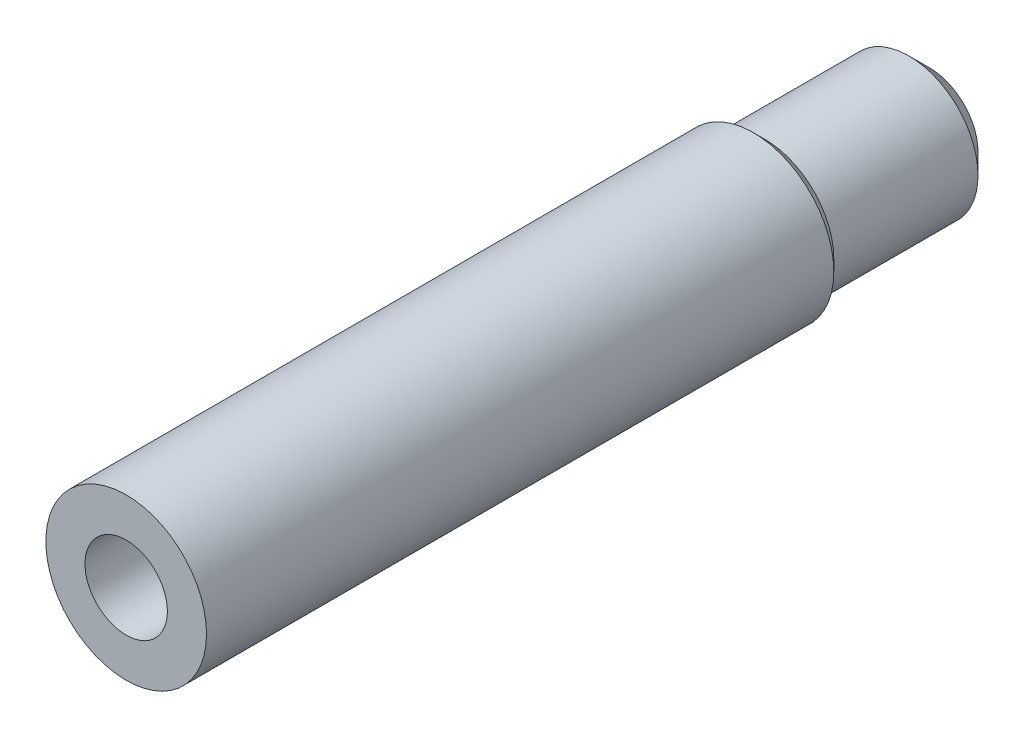
ISO-10303-21;
HEADER;
FILE_DESCRIPTION(('STEP AP214'),'2;1');
FILE_NAME('part.step','',(''),(''),'','','');
FILE_SCHEMA(('AUTOMOTIVE_DESIGN { 1 0 10303 214 1 1 1 1 }'));
ENDSEC;
DATA;
#1=APPLICATION_CONTEXT('core data for automotive mechanical design processes');
#2=APPLICATION_PROTOCOL_DEFINITION('international standard','automotive_design',2000,#1);
#3=PRODUCT_CONTEXT('',#1,'mechanical');
#4=PRODUCT('Part','Part','',(#3));
#5=PRODUCT_RELATED_PRODUCT_CATEGORY('part','',(#4));
#6=PRODUCT_DEFINITION_FORMATION('','',#4);
#7=PRODUCT_DEFINITION_CONTEXT('part definition',#1,'design');
#8=PRODUCT_DEFINITION('design','',#6,#7);
#9=PRODUCT_DEFINITION_SHAPE('','',#8);
#10=(LENGTH_UNIT() NAMED_UNIT(*) SI_UNIT(.MILLI.,.METRE.));
#11=(NAMED_UNIT(*) PLANE_ANGLE_UNIT() SI_UNIT($,.RADIAN.));
#12=(NAMED_UNIT(*) SI_UNIT($,.STERADIAN.) SOLID_ANGLE_UNIT());
#13=UNCERTAINTY_MEASURE_WITH_UNIT(LENGTH_MEASURE(1.E-05),#10,'distance_accuracy_value','');
#14=(GEOMETRIC_REPRESENTATION_CONTEXT(3) GLOBAL_UNCERTAINTY_ASSIGNED_CONTEXT((#13)) GLOBAL_UNIT_ASSIGNED_CONTEXT((#10,
#11,#12)) REPRESENTATION_CONTEXT('',''));
#15=CARTESIAN_POINT('',(0.,0.,0.));
#16=DIRECTION('',(0.,0.,1.));
#17=DIRECTION('',(1.,0.,0.));
#18=AXIS2_PLACEMENT_3D('',#15,#16,#17);
#19=CARTESIAN_POINT('',(0.,0.,9.));
#20=DIRECTION('',(0.,0.,-1.));
#21=DIRECTION('',(-1.,0.,0.));
#22=AXIS2_PLACEMENT_3D('',#19,#20,#21);
#23=CYLINDRICAL_SURFACE('',#22,3.35);
#24=CARTESIAN_POINT('',(0.,0.,0.999999999999997));
#25=DIRECTION('',(0.,0.,1.));
#26=DIRECTION('',(1.,0.,0.));
#27=AXIS2_PLACEMENT_3D('',#24,#25,#26);
#28=CIRCLE('',#27,3.35);
#29=CARTESIAN_POINT('',(3.35,0.,0.999999999999997));
#30=VERTEX_POINT('',#29);
#31=EDGE_CURVE('E52',#30,#30,#28,.T.);
#32=ORIENTED_EDGE('',*,*,#31,.T.);
#33=EDGE_LOOP('',(#32));
#34=FACE_BOUND('',#33,.T.);
#35=CARTESIAN_POINT('',(0.,0.,7.99999999999999));
#36=DIRECTION('',(0.,0.,1.));
#37=DIRECTION('',(1.,0.,0.));
#38=AXIS2_PLACEMENT_3D('',#35,#36,#37);
#39=CIRCLE('',#38,3.35);
#40=CARTESIAN_POINT('',(3.35,0.,7.99999999999999));
#41=VERTEX_POINT('',#40);
#42=EDGE_CURVE('E77',#41,#41,#39,.F.);
#43=ORIENTED_EDGE('',*,*,#42,.T.);
#44=EDGE_LOOP('',(#43));
#45=FACE_BOUND('',#44,.T.);
#46=ADVANCED_FACE('F45',(#34,#45),#23,.T.);
#47=CARTESIAN_POINT('',(0.,0.,0.));
#48=DIRECTION('',(0.,0.,1.));
#49=DIRECTION('',(1.,0.,0.));
#50=AXIS2_PLACEMENT_3D('',#47,#48,#49);
#51=PLANE('',#50);
#52=CARTESIAN_POINT('',(0.,0.,0.));
#53=DIRECTION('',(0.,0.,1.));
#54=DIRECTION('',(1.,0.,0.));
#55=AXIS2_PLACEMENT_3D('',#52,#53,#54);
#56=CIRCLE('',#55,2.);
#57=CARTESIAN_POINT('',(2.,0.,0.));
#58=VERTEX_POINT('',#57);
#59=EDGE_CURVE('E68',#58,#58,#56,.T.);
#60=ORIENTED_EDGE('',*,*,#59,.T.);
#61=EDGE_LOOP('',(#60));
#62=FACE_BOUND('',#61,.T.);
#63=CARTESIAN_POINT('',(0.,0.,0.));
#64=DIRECTION('',(0.,0.,1.));
#65=DIRECTION('',(1.,0.,0.));
#66=AXIS2_PLACEMENT_3D('',#63,#64,#65);
#67=CIRCLE('',#66,2.35);
#68=CARTESIAN_POINT('',(2.35,0.,0.));
#69=VERTEX_POINT('',#68);
#70=EDGE_CURVE('E10',#69,#69,#67,.F.);
#71=ORIENTED_EDGE('',*,*,#70,.T.);
#72=EDGE_LOOP('',(#71));
#73=FACE_BOUND('',#72,.T.);
#74=ADVANCED_FACE('F100',(#62,#73),#51,.F.);
#75=CARTESIAN_POINT('',(0.,0.,39.));
#76=DIRECTION('',(0.,0.,-1.));
#77=DIRECTION('',(-1.,0.,0.));
#78=AXIS2_PLACEMENT_3D('',#75,#76,#77);
#79=CYLINDRICAL_SURFACE('',#78,3.9);
#80=CARTESIAN_POINT('',(0.,0.,8.54999999999999));
#81=DIRECTION('',(0.,0.,1.));
#82=DIRECTION('',(1.,0.,0.));
#83=AXIS2_PLACEMENT_3D('',#80,#81,#82);
#84=CIRCLE('',#83,3.9);
#85=CARTESIAN_POINT('',(3.9,0.,8.54999999999999));
#86=VERTEX_POINT('',#85);
#87=EDGE_CURVE('E59',#86,#86,#84,.T.);
#88=ORIENTED_EDGE('',*,*,#87,.T.);
#89=EDGE_LOOP('',(#88));
#90=FACE_BOUND('',#89,.T.);
#91=CARTESIAN_POINT('',(0.,0.,39.));
#92=DIRECTION('',(0.,0.,1.));
#93=DIRECTION('',(1.,0.,0.));
#94=AXIS2_PLACEMENT_3D('',#91,#92,#93);
#95=CIRCLE('',#94,3.9);
#96=CARTESIAN_POINT('',(3.9,0.,39.));
#97=VERTEX_POINT('',#96);
#98=EDGE_CURVE('E72',#97,#97,#95,.T.);
#99=ORIENTED_EDGE('',*,*,#98,.F.);
#100=EDGE_LOOP('',(#99));
#101=FACE_BOUND('',#100,.T.);
#102=ADVANCED_FACE('F98',(#90,#101),#79,.T.);
#103=CARTESIAN_POINT('',(0.,0.,39.));
#104=DIRECTION('',(0.,0.,1.));
#105=DIRECTION('',(1.,0.,0.));
#106=AXIS2_PLACEMENT_3D('',#103,#104,#105);
#107=PLANE('',#106);
#108=CARTESIAN_POINT('',(0.,0.,39.000012));
#109=DIRECTION('',(0.,0.,1.));
#110=DIRECTION('',(1.,0.,0.));
#111=AXIS2_PLACEMENT_3D('',#108,#109,#110);
#112=CIRCLE('',#111,2.);
#113=CARTESIAN_POINT('',(2.,0.,39.000012));
#114=VERTEX_POINT('',#113);
#115=EDGE_CURVE('E63',#114,#114,#112,.T.);
#116=ORIENTED_EDGE('',*,*,#115,.F.);
#117=EDGE_LOOP('',(#116));
#118=FACE_BOUND('',#117,.T.);
#119=ORIENTED_EDGE('',*,*,#98,.T.);
#120=EDGE_LOOP('',(#119));
#121=FACE_BOUND('',#120,.T.);
#122=ADVANCED_FACE('F62',(#118,#121),#107,.T.);
#123=CARTESIAN_POINT('',(0.,0.,9.));
#124=DIRECTION('',(0.,0.,1.));
#125=DIRECTION('',(1.,0.,0.));
#126=AXIS2_PLACEMENT_3D('',#123,#124,#125);
#127=CONICAL_SURFACE('',#126,4.35000000000002,0.785398163397453);
#128=ORIENTED_EDGE('',*,*,#42,.F.);
#129=EDGE_LOOP('',(#128));
#130=FACE_BOUND('',#129,.T.);
#131=ORIENTED_EDGE('',*,*,#87,.F.);
#132=EDGE_LOOP('',(#131));
#133=FACE_BOUND('',#132,.T.);
#134=ADVANCED_FACE('F93',(#130,#133),#127,.T.);
#135=CARTESIAN_POINT('',(0.,0.,0.999999999999997));
#136=DIRECTION('',(0.,0.,1.));
#137=DIRECTION('',(1.,0.,0.));
#138=AXIS2_PLACEMENT_3D('',#135,#136,#137);
#139=CONICAL_SURFACE('',#138,3.35,0.785398163397451);
#140=ORIENTED_EDGE('',*,*,#70,.F.);
#141=EDGE_LOOP('',(#140));
#142=FACE_BOUND('',#141,.T.);
#143=ORIENTED_EDGE('',*,*,#31,.F.);
#144=EDGE_LOOP('',(#143));
#145=FACE_BOUND('',#144,.T.);
#146=ADVANCED_FACE('F44',(#142,#145),#139,.T.);
#147=CARTESIAN_POINT('',(0.,0.,0.));
#148=DIRECTION('',(0.,0.,1.));
#149=DIRECTION('',(1.,0.,0.));
#150=AXIS2_PLACEMENT_3D('',#147,#148,#149);
#151=CYLINDRICAL_SURFACE('',#150,2.);
#152=ORIENTED_EDGE('',*,*,#59,.F.);
#153=EDGE_LOOP('',(#152));
#154=FACE_BOUND('',#153,.T.);
#155=ORIENTED_EDGE('',*,*,#115,.T.);
#156=EDGE_LOOP('',(#155));
#157=FACE_BOUND('',#156,.T.);
#158=ADVANCED_FACE('F85',(#154,#157),#151,.F.);
#159=CLOSED_SHELL('',(#46,#74,#102,#122,#134,#146,#158));
#160=MANIFOLD_SOLID_BREP('B2',#159);
#161=ADVANCED_BREP_SHAPE_REPRESENTATION('',(#18,#160),#14);
#162=SHAPE_DEFINITION_REPRESENTATION(#9,#161);
ENDSEC;
END-ISO-10303-21;
